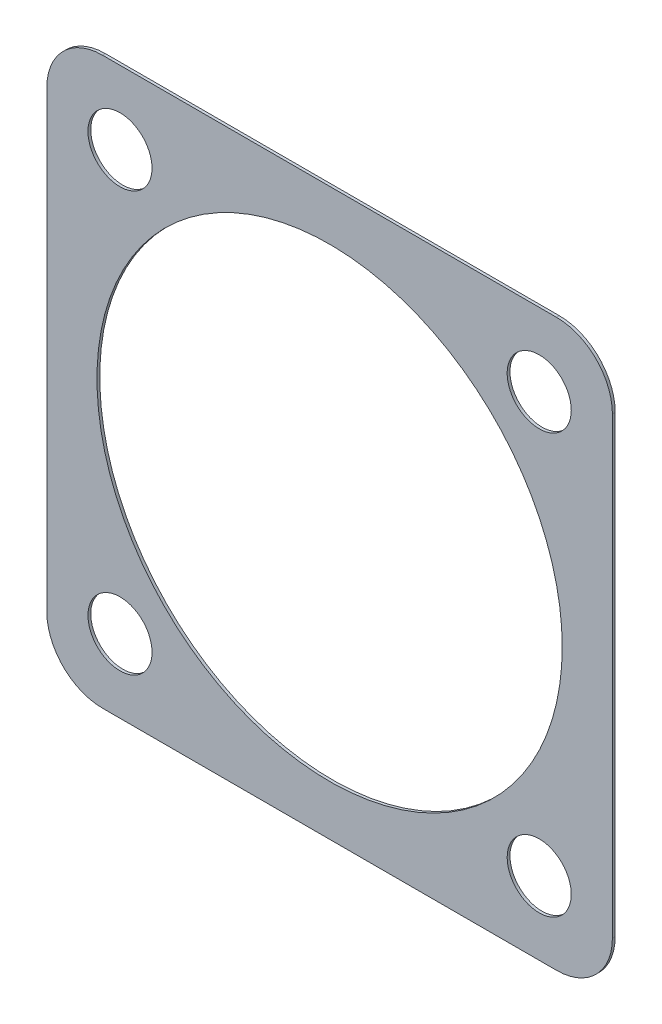
ISO-10303-21;
HEADER;
FILE_DESCRIPTION(('STEP AP214'),'2;1');
FILE_NAME('part.step','',(''),(''),'','','');
FILE_SCHEMA(('AUTOMOTIVE_DESIGN { 1 0 10303 214 1 1 1 1 }'));
ENDSEC;
DATA;
#1=APPLICATION_CONTEXT('core data for automotive mechanical design processes');
#2=APPLICATION_PROTOCOL_DEFINITION('international standard','automotive_design',2000,#1);
#3=PRODUCT_CONTEXT('',#1,'mechanical');
#4=PRODUCT('Part','Part','',(#3));
#5=PRODUCT_RELATED_PRODUCT_CATEGORY('part','',(#4));
#6=PRODUCT_DEFINITION_FORMATION('','',#4);
#7=PRODUCT_DEFINITION_CONTEXT('part definition',#1,'design');
#8=PRODUCT_DEFINITION('design','',#6,#7);
#9=PRODUCT_DEFINITION_SHAPE('','',#8);
#10=(LENGTH_UNIT() NAMED_UNIT(*) SI_UNIT(.MILLI.,.METRE.));
#11=(NAMED_UNIT(*) PLANE_ANGLE_UNIT() SI_UNIT($,.RADIAN.));
#12=(NAMED_UNIT(*) SI_UNIT($,.STERADIAN.) SOLID_ANGLE_UNIT());
#13=UNCERTAINTY_MEASURE_WITH_UNIT(LENGTH_MEASURE(1.E-05),#10,'distance_accuracy_value','');
#14=(GEOMETRIC_REPRESENTATION_CONTEXT(3) GLOBAL_UNCERTAINTY_ASSIGNED_CONTEXT((#13)) GLOBAL_UNIT_ASSIGNED_CONTEXT((#10,
#11,#12)) REPRESENTATION_CONTEXT('',''));
#15=CARTESIAN_POINT('',(0.,0.,0.));
#16=DIRECTION('',(0.,0.,1.));
#17=DIRECTION('',(1.,0.,0.));
#18=AXIS2_PLACEMENT_3D('',#15,#16,#17);
#19=CARTESIAN_POINT('',(40.75,40.75,0.5));
#20=DIRECTION('',(0.,0.,1.));
#21=DIRECTION('',(1.,0.,0.));
#22=AXIS2_PLACEMENT_3D('',#19,#20,#21);
#23=PLANE('',#22);
#24=CARTESIAN_POINT('',(37.6180807591243,-37.6180807591243,0.5));
#25=DIRECTION('',(0.,0.,1.));
#26=DIRECTION('',(-1.,0.,0.));
#27=AXIS2_PLACEMENT_3D('',#24,#25,#26);
#28=CIRCLE('',#27,5.74999999999999);
#29=CARTESIAN_POINT('',(31.8680807591243,-37.6180807591243,0.5));
#30=VERTEX_POINT('',#29);
#31=EDGE_CURVE('E202',#30,#30,#28,.T.);
#32=ORIENTED_EDGE('',*,*,#31,.F.);
#33=EDGE_LOOP('',(#32));
#34=FACE_BOUND('',#33,.T.);
#35=CARTESIAN_POINT('',(-37.6180807591243,37.6180807591243,0.5));
#36=DIRECTION('',(0.,0.,1.));
#37=DIRECTION('',(-1.,0.,0.));
#38=AXIS2_PLACEMENT_3D('',#35,#36,#37);
#39=CIRCLE('',#38,5.74999999999999);
#40=CARTESIAN_POINT('',(-43.3680807591243,37.6180807591243,0.5));
#41=VERTEX_POINT('',#40);
#42=EDGE_CURVE('E190',#41,#41,#39,.T.);
#43=ORIENTED_EDGE('',*,*,#42,.F.);
#44=EDGE_LOOP('',(#43));
#45=FACE_BOUND('',#44,.T.);
#46=CARTESIAN_POINT('',(40.75,40.75,0.5));
#47=DIRECTION('',(0.,0.,1.));
#48=DIRECTION('',(1.,0.,0.));
#49=AXIS2_PLACEMENT_3D('',#46,#47,#48);
#50=CIRCLE('',#49,10.);
#51=CARTESIAN_POINT('',(50.75,40.75,0.5));
#52=VERTEX_POINT('',#51);
#53=CARTESIAN_POINT('',(40.75,50.75,0.5));
#54=VERTEX_POINT('',#53);
#55=EDGE_CURVE('E153',#52,#54,#50,.T.);
#56=ORIENTED_EDGE('',*,*,#55,.T.);
#57=DIRECTION('',(-1.,0.,0.));
#58=VECTOR('',#57,1.);
#59=CARTESIAN_POINT('',(-40.75,50.75,0.5));
#60=LINE('',#59,#58);
#61=CARTESIAN_POINT('',(-40.75,50.75,0.5));
#62=VERTEX_POINT('',#61);
#63=EDGE_CURVE('E101',#54,#62,#60,.T.);
#64=ORIENTED_EDGE('',*,*,#63,.T.);
#65=CARTESIAN_POINT('',(-40.75,40.75,0.5));
#66=DIRECTION('',(0.,0.,1.));
#67=DIRECTION('',(-1.,0.,0.));
#68=AXIS2_PLACEMENT_3D('',#65,#66,#67);
#69=CIRCLE('',#68,10.);
#70=CARTESIAN_POINT('',(-50.75,40.75,0.5));
#71=VERTEX_POINT('',#70);
#72=EDGE_CURVE('E168',#62,#71,#69,.T.);
#73=ORIENTED_EDGE('',*,*,#72,.T.);
#74=DIRECTION('',(0.,-1.,0.));
#75=VECTOR('',#74,1.);
#76=CARTESIAN_POINT('',(-50.75,40.75,0.5));
#77=LINE('',#76,#75);
#78=CARTESIAN_POINT('',(-50.75,-40.75,0.5));
#79=VERTEX_POINT('',#78);
#80=EDGE_CURVE('E181',#71,#79,#77,.T.);
#81=ORIENTED_EDGE('',*,*,#80,.T.);
#82=CARTESIAN_POINT('',(-40.75,-40.75,0.5));
#83=DIRECTION('',(0.,0.,1.));
#84=DIRECTION('',(1.,0.,0.));
#85=AXIS2_PLACEMENT_3D('',#82,#83,#84);
#86=CIRCLE('',#85,10.);
#87=CARTESIAN_POINT('',(-40.75,-50.75,0.5));
#88=VERTEX_POINT('',#87);
#89=EDGE_CURVE('E120',#79,#88,#86,.T.);
#90=ORIENTED_EDGE('',*,*,#89,.T.);
#91=DIRECTION('',(1.,0.,0.));
#92=VECTOR('',#91,1.);
#93=CARTESIAN_POINT('',(-40.75,-50.75,0.5));
#94=LINE('',#93,#92);
#95=CARTESIAN_POINT('',(40.75,-50.75,0.5));
#96=VERTEX_POINT('',#95);
#97=EDGE_CURVE('E114',#88,#96,#94,.T.);
#98=ORIENTED_EDGE('',*,*,#97,.T.);
#99=CARTESIAN_POINT('',(40.75,-40.75,0.5));
#100=DIRECTION('',(0.,0.,1.));
#101=DIRECTION('',(-1.,0.,0.));
#102=AXIS2_PLACEMENT_3D('',#99,#100,#101);
#103=CIRCLE('',#102,10.);
#104=CARTESIAN_POINT('',(50.75,-40.75,0.5));
#105=VERTEX_POINT('',#104);
#106=EDGE_CURVE('E118',#96,#105,#103,.T.);
#107=ORIENTED_EDGE('',*,*,#106,.T.);
#108=DIRECTION('',(0.,1.,0.));
#109=VECTOR('',#108,1.);
#110=CARTESIAN_POINT('',(50.75,40.75,0.5));
#111=LINE('',#110,#109);
#112=EDGE_CURVE('E58',#105,#52,#111,.T.);
#113=ORIENTED_EDGE('',*,*,#112,.T.);
#114=EDGE_LOOP('',(#56,#64,#73,#81,#90,#98,#107,#113));
#115=FACE_BOUND('',#114,.T.);
#116=CARTESIAN_POINT('',(37.6180807591243,37.6180807591243,0.5));
#117=DIRECTION('',(0.,0.,1.));
#118=DIRECTION('',(1.,0.,0.));
#119=AXIS2_PLACEMENT_3D('',#116,#117,#118);
#120=CIRCLE('',#119,5.74999999999999);
#121=CARTESIAN_POINT('',(43.3680807591243,37.6180807591243,0.5));
#122=VERTEX_POINT('',#121);
#123=EDGE_CURVE('E142',#122,#122,#120,.T.);
#124=ORIENTED_EDGE('',*,*,#123,.F.);
#125=EDGE_LOOP('',(#124));
#126=FACE_BOUND('',#125,.T.);
#127=CARTESIAN_POINT('',(-37.6180807591243,-37.6180807591243,0.5));
#128=DIRECTION('',(0.,0.,1.));
#129=DIRECTION('',(1.,0.,0.));
#130=AXIS2_PLACEMENT_3D('',#127,#128,#129);
#131=CIRCLE('',#130,5.74999999999999);
#132=CARTESIAN_POINT('',(-31.8680807591243,-37.6180807591243,0.5));
#133=VERTEX_POINT('',#132);
#134=EDGE_CURVE('E196',#133,#133,#131,.T.);
#135=ORIENTED_EDGE('',*,*,#134,.F.);
#136=EDGE_LOOP('',(#135));
#137=FACE_BOUND('',#136,.T.);
#138=CARTESIAN_POINT('',(0.,0.,0.5));
#139=DIRECTION('',(0.,0.,1.));
#140=DIRECTION('',(1.,0.,0.));
#141=AXIS2_PLACEMENT_3D('',#138,#139,#140);
#142=CIRCLE('',#141,41.75);
#143=CARTESIAN_POINT('',(41.75,0.,0.5));
#144=VERTEX_POINT('',#143);
#145=EDGE_CURVE('E208',#144,#144,#142,.T.);
#146=ORIENTED_EDGE('',*,*,#145,.F.);
#147=EDGE_LOOP('',(#146));
#148=FACE_BOUND('',#147,.T.);
#149=ADVANCED_FACE('F41',(#34,#45,#115,#126,#137,#148),#23,.T.);
#150=CARTESIAN_POINT('',(40.75,40.75,0.));
#151=DIRECTION('',(0.,0.,1.));
#152=DIRECTION('',(1.,0.,0.));
#153=AXIS2_PLACEMENT_3D('',#150,#151,#152);
#154=PLANE('',#153);
#155=CARTESIAN_POINT('',(40.75,40.75,0.));
#156=DIRECTION('',(0.,0.,1.));
#157=DIRECTION('',(1.,0.,0.));
#158=AXIS2_PLACEMENT_3D('',#155,#156,#157);
#159=CIRCLE('',#158,10.);
#160=CARTESIAN_POINT('',(50.75,40.75,0.));
#161=VERTEX_POINT('',#160);
#162=CARTESIAN_POINT('',(40.75,50.75,0.));
#163=VERTEX_POINT('',#162);
#164=EDGE_CURVE('E138',#161,#163,#159,.T.);
#165=ORIENTED_EDGE('',*,*,#164,.F.);
#166=DIRECTION('',(0.,1.,0.));
#167=VECTOR('',#166,1.);
#168=CARTESIAN_POINT('',(50.75,40.75,0.));
#169=LINE('',#168,#167);
#170=CARTESIAN_POINT('',(50.75,-40.75,0.));
#171=VERTEX_POINT('',#170);
#172=EDGE_CURVE('E93',#171,#161,#169,.T.);
#173=ORIENTED_EDGE('',*,*,#172,.F.);
#174=CARTESIAN_POINT('',(40.75,-40.75,0.));
#175=DIRECTION('',(0.,0.,1.));
#176=DIRECTION('',(-1.,0.,0.));
#177=AXIS2_PLACEMENT_3D('',#174,#175,#176);
#178=CIRCLE('',#177,10.);
#179=CARTESIAN_POINT('',(40.75,-50.75,0.));
#180=VERTEX_POINT('',#179);
#181=EDGE_CURVE('E87',#180,#171,#178,.T.);
#182=ORIENTED_EDGE('',*,*,#181,.F.);
#183=DIRECTION('',(1.,0.,0.));
#184=VECTOR('',#183,1.);
#185=CARTESIAN_POINT('',(-40.75,-50.75,0.));
#186=LINE('',#185,#184);
#187=CARTESIAN_POINT('',(-40.75,-50.75,0.));
#188=VERTEX_POINT('',#187);
#189=EDGE_CURVE('E128',#188,#180,#186,.T.);
#190=ORIENTED_EDGE('',*,*,#189,.F.);
#191=CARTESIAN_POINT('',(-40.75,-40.75,0.));
#192=DIRECTION('',(0.,0.,1.));
#193=DIRECTION('',(1.,0.,0.));
#194=AXIS2_PLACEMENT_3D('',#191,#192,#193);
#195=CIRCLE('',#194,10.);
#196=CARTESIAN_POINT('',(-50.75,-40.75,0.));
#197=VERTEX_POINT('',#196);
#198=EDGE_CURVE('E148',#197,#188,#195,.T.);
#199=ORIENTED_EDGE('',*,*,#198,.F.);
#200=DIRECTION('',(0.,-1.,0.));
#201=VECTOR('',#200,1.);
#202=CARTESIAN_POINT('',(-50.75,40.75,0.));
#203=LINE('',#202,#201);
#204=CARTESIAN_POINT('',(-50.75,40.75,0.));
#205=VERTEX_POINT('',#204);
#206=EDGE_CURVE('E146',#205,#197,#203,.T.);
#207=ORIENTED_EDGE('',*,*,#206,.F.);
#208=CARTESIAN_POINT('',(-40.75,40.75,0.));
#209=DIRECTION('',(0.,0.,1.));
#210=DIRECTION('',(-1.,0.,0.));
#211=AXIS2_PLACEMENT_3D('',#208,#209,#210);
#212=CIRCLE('',#211,10.);
#213=CARTESIAN_POINT('',(-40.75,50.75,0.));
#214=VERTEX_POINT('',#213);
#215=EDGE_CURVE('E144',#214,#205,#212,.T.);
#216=ORIENTED_EDGE('',*,*,#215,.F.);
#217=DIRECTION('',(-1.,0.,0.));
#218=VECTOR('',#217,1.);
#219=CARTESIAN_POINT('',(-40.75,50.75,0.));
#220=LINE('',#219,#218);
#221=EDGE_CURVE('E141',#163,#214,#220,.T.);
#222=ORIENTED_EDGE('',*,*,#221,.F.);
#223=EDGE_LOOP('',(#165,#173,#182,#190,#199,#207,#216,#222));
#224=FACE_BOUND('',#223,.T.);
#225=CARTESIAN_POINT('',(37.6180807591243,37.6180807591243,0.));
#226=DIRECTION('',(0.,0.,1.));
#227=DIRECTION('',(1.,0.,0.));
#228=AXIS2_PLACEMENT_3D('',#225,#226,#227);
#229=CIRCLE('',#228,5.74999999999999);
#230=CARTESIAN_POINT('',(43.3680807591243,37.6180807591243,0.));
#231=VERTEX_POINT('',#230);
#232=EDGE_CURVE('E187',#231,#231,#229,.T.);
#233=ORIENTED_EDGE('',*,*,#232,.T.);
#234=EDGE_LOOP('',(#233));
#235=FACE_BOUND('',#234,.T.);
#236=CARTESIAN_POINT('',(-37.6180807591243,37.6180807591243,0.));
#237=DIRECTION('',(0.,0.,1.));
#238=DIRECTION('',(-1.,0.,0.));
#239=AXIS2_PLACEMENT_3D('',#236,#237,#238);
#240=CIRCLE('',#239,5.74999999999999);
#241=CARTESIAN_POINT('',(-43.3680807591243,37.6180807591243,0.));
#242=VERTEX_POINT('',#241);
#243=EDGE_CURVE('E193',#242,#242,#240,.T.);
#244=ORIENTED_EDGE('',*,*,#243,.T.);
#245=EDGE_LOOP('',(#244));
#246=FACE_BOUND('',#245,.T.);
#247=CARTESIAN_POINT('',(-37.6180807591243,-37.6180807591243,0.));
#248=DIRECTION('',(0.,0.,1.));
#249=DIRECTION('',(1.,0.,0.));
#250=AXIS2_PLACEMENT_3D('',#247,#248,#249);
#251=CIRCLE('',#250,5.74999999999999);
#252=CARTESIAN_POINT('',(-31.8680807591243,-37.6180807591243,0.));
#253=VERTEX_POINT('',#252);
#254=EDGE_CURVE('E199',#253,#253,#251,.T.);
#255=ORIENTED_EDGE('',*,*,#254,.T.);
#256=EDGE_LOOP('',(#255));
#257=FACE_BOUND('',#256,.T.);
#258=CARTESIAN_POINT('',(37.6180807591243,-37.6180807591243,0.));
#259=DIRECTION('',(0.,0.,1.));
#260=DIRECTION('',(-1.,0.,0.));
#261=AXIS2_PLACEMENT_3D('',#258,#259,#260);
#262=CIRCLE('',#261,5.74999999999999);
#263=CARTESIAN_POINT('',(31.8680807591243,-37.6180807591243,0.));
#264=VERTEX_POINT('',#263);
#265=EDGE_CURVE('E205',#264,#264,#262,.T.);
#266=ORIENTED_EDGE('',*,*,#265,.T.);
#267=EDGE_LOOP('',(#266));
#268=FACE_BOUND('',#267,.T.);
#269=CARTESIAN_POINT('',(0.,0.,0.));
#270=DIRECTION('',(0.,0.,1.));
#271=DIRECTION('',(1.,0.,0.));
#272=AXIS2_PLACEMENT_3D('',#269,#270,#271);
#273=CIRCLE('',#272,41.75);
#274=CARTESIAN_POINT('',(41.75,0.,0.));
#275=VERTEX_POINT('',#274);
#276=EDGE_CURVE('E211',#275,#275,#273,.T.);
#277=ORIENTED_EDGE('',*,*,#276,.T.);
#278=EDGE_LOOP('',(#277));
#279=FACE_BOUND('',#278,.T.);
#280=ADVANCED_FACE('F172',(#224,#235,#246,#257,#268,#279),#154,.F.);
#281=CARTESIAN_POINT('',(40.75,40.75,0.5));
#282=DIRECTION('',(0.,0.,-1.));
#283=DIRECTION('',(-1.,0.,0.));
#284=AXIS2_PLACEMENT_3D('',#281,#282,#283);
#285=CYLINDRICAL_SURFACE('',#284,10.);
#286=ORIENTED_EDGE('',*,*,#164,.T.);
#287=DIRECTION('',(0.,0.,-1.));
#288=VECTOR('',#287,1.);
#289=CARTESIAN_POINT('',(40.75,50.75,0.5));
#290=LINE('',#289,#288);
#291=EDGE_CURVE('E11',#54,#163,#290,.T.);
#292=ORIENTED_EDGE('',*,*,#291,.F.);
#293=ORIENTED_EDGE('',*,*,#55,.F.);
#294=DIRECTION('',(0.,0.,-1.));
#295=VECTOR('',#294,1.);
#296=CARTESIAN_POINT('',(50.75,40.75,0.5));
#297=LINE('',#296,#295);
#298=EDGE_CURVE('E134',#52,#161,#297,.T.);
#299=ORIENTED_EDGE('',*,*,#298,.T.);
#300=EDGE_LOOP('',(#286,#292,#293,#299));
#301=FACE_BOUND('',#300,.T.);
#302=ADVANCED_FACE('F43',(#301),#285,.T.);
#303=CARTESIAN_POINT('',(-40.75,50.75,0.5));
#304=DIRECTION('',(0.,-1.,0.));
#305=DIRECTION('',(0.,0.,-1.));
#306=AXIS2_PLACEMENT_3D('',#303,#304,#305);
#307=PLANE('',#306);
#308=ORIENTED_EDGE('',*,*,#221,.T.);
#309=DIRECTION('',(0.,0.,-1.));
#310=VECTOR('',#309,1.);
#311=CARTESIAN_POINT('',(-40.75,50.75,0.5));
#312=LINE('',#311,#310);
#313=EDGE_CURVE('E50',#62,#214,#312,.T.);
#314=ORIENTED_EDGE('',*,*,#313,.F.);
#315=ORIENTED_EDGE('',*,*,#63,.F.);
#316=ORIENTED_EDGE('',*,*,#291,.T.);
#317=EDGE_LOOP('',(#308,#314,#315,#316));
#318=FACE_BOUND('',#317,.T.);
#319=ADVANCED_FACE('F245',(#318),#307,.F.);
#320=CARTESIAN_POINT('',(-40.75,40.75,0.5));
#321=DIRECTION('',(0.,0.,-1.));
#322=DIRECTION('',(-1.,0.,0.));
#323=AXIS2_PLACEMENT_3D('',#320,#321,#322);
#324=CYLINDRICAL_SURFACE('',#323,10.);
#325=ORIENTED_EDGE('',*,*,#215,.T.);
#326=DIRECTION('',(0.,0.,-1.));
#327=VECTOR('',#326,1.);
#328=CARTESIAN_POINT('',(-50.75,40.75,0.5));
#329=LINE('',#328,#327);
#330=EDGE_CURVE('E160',#71,#205,#329,.T.);
#331=ORIENTED_EDGE('',*,*,#330,.F.);
#332=ORIENTED_EDGE('',*,*,#72,.F.);
#333=ORIENTED_EDGE('',*,*,#313,.T.);
#334=EDGE_LOOP('',(#325,#331,#332,#333));
#335=FACE_BOUND('',#334,.T.);
#336=ADVANCED_FACE('F166',(#335),#324,.T.);
#337=CARTESIAN_POINT('',(-50.75,40.75,0.5));
#338=DIRECTION('',(1.,0.,0.));
#339=DIRECTION('',(0.,0.,-1.));
#340=AXIS2_PLACEMENT_3D('',#337,#338,#339);
#341=PLANE('',#340);
#342=ORIENTED_EDGE('',*,*,#206,.T.);
#343=DIRECTION('',(0.,0.,-1.));
#344=VECTOR('',#343,1.);
#345=CARTESIAN_POINT('',(-50.75,-40.75,0.5));
#346=LINE('',#345,#344);
#347=EDGE_CURVE('E157',#79,#197,#346,.T.);
#348=ORIENTED_EDGE('',*,*,#347,.F.);
#349=ORIENTED_EDGE('',*,*,#80,.F.);
#350=ORIENTED_EDGE('',*,*,#330,.T.);
#351=EDGE_LOOP('',(#342,#348,#349,#350));
#352=FACE_BOUND('',#351,.T.);
#353=ADVANCED_FACE('F177',(#352),#341,.F.);
#354=CARTESIAN_POINT('',(-40.75,-40.75,0.5));
#355=DIRECTION('',(0.,0.,-1.));
#356=DIRECTION('',(-1.,0.,0.));
#357=AXIS2_PLACEMENT_3D('',#354,#355,#356);
#358=CYLINDRICAL_SURFACE('',#357,10.);
#359=ORIENTED_EDGE('',*,*,#198,.T.);
#360=DIRECTION('',(0.,0.,-1.));
#361=VECTOR('',#360,1.);
#362=CARTESIAN_POINT('',(-40.75,-50.75,0.5));
#363=LINE('',#362,#361);
#364=EDGE_CURVE('E129',#88,#188,#363,.T.);
#365=ORIENTED_EDGE('',*,*,#364,.F.);
#366=ORIENTED_EDGE('',*,*,#89,.F.);
#367=ORIENTED_EDGE('',*,*,#347,.T.);
#368=EDGE_LOOP('',(#359,#365,#366,#367));
#369=FACE_BOUND('',#368,.T.);
#370=ADVANCED_FACE('F180',(#369),#358,.T.);
#371=CARTESIAN_POINT('',(-40.75,-50.75,0.5));
#372=DIRECTION('',(0.,1.,0.));
#373=DIRECTION('',(0.,0.,1.));
#374=AXIS2_PLACEMENT_3D('',#371,#372,#373);
#375=PLANE('',#374);
#376=ORIENTED_EDGE('',*,*,#189,.T.);
#377=DIRECTION('',(0.,0.,-1.));
#378=VECTOR('',#377,1.);
#379=CARTESIAN_POINT('',(40.75,-50.75,0.5));
#380=LINE('',#379,#378);
#381=EDGE_CURVE('E125',#96,#180,#380,.T.);
#382=ORIENTED_EDGE('',*,*,#381,.F.);
#383=ORIENTED_EDGE('',*,*,#97,.F.);
#384=ORIENTED_EDGE('',*,*,#364,.T.);
#385=EDGE_LOOP('',(#376,#382,#383,#384));
#386=FACE_BOUND('',#385,.T.);
#387=ADVANCED_FACE('F126',(#386),#375,.F.);
#388=CARTESIAN_POINT('',(40.75,-40.75,0.5));
#389=DIRECTION('',(0.,0.,-1.));
#390=DIRECTION('',(-1.,0.,0.));
#391=AXIS2_PLACEMENT_3D('',#388,#389,#390);
#392=CYLINDRICAL_SURFACE('',#391,10.);
#393=ORIENTED_EDGE('',*,*,#181,.T.);
#394=DIRECTION('',(0.,0.,-1.));
#395=VECTOR('',#394,1.);
#396=CARTESIAN_POINT('',(50.75,-40.75,0.5));
#397=LINE('',#396,#395);
#398=EDGE_CURVE('E130',#105,#171,#397,.T.);
#399=ORIENTED_EDGE('',*,*,#398,.F.);
#400=ORIENTED_EDGE('',*,*,#106,.F.);
#401=ORIENTED_EDGE('',*,*,#381,.T.);
#402=EDGE_LOOP('',(#393,#399,#400,#401));
#403=FACE_BOUND('',#402,.T.);
#404=ADVANCED_FACE('F132',(#403),#392,.T.);
#405=CARTESIAN_POINT('',(50.75,40.75,0.5));
#406=DIRECTION('',(-1.,0.,0.));
#407=DIRECTION('',(0.,0.,1.));
#408=AXIS2_PLACEMENT_3D('',#405,#406,#407);
#409=PLANE('',#408);
#410=ORIENTED_EDGE('',*,*,#172,.T.);
#411=ORIENTED_EDGE('',*,*,#298,.F.);
#412=ORIENTED_EDGE('',*,*,#112,.F.);
#413=ORIENTED_EDGE('',*,*,#398,.T.);
#414=EDGE_LOOP('',(#410,#411,#412,#413));
#415=FACE_BOUND('',#414,.T.);
#416=ADVANCED_FACE('F233',(#415),#409,.F.);
#417=CARTESIAN_POINT('',(37.6180807591243,37.6180807591243,0.5));
#418=DIRECTION('',(0.,0.,-1.));
#419=DIRECTION('',(-1.,0.,0.));
#420=AXIS2_PLACEMENT_3D('',#417,#418,#419);
#421=CYLINDRICAL_SURFACE('',#420,5.74999999999999);
#422=ORIENTED_EDGE('',*,*,#123,.T.);
#423=EDGE_LOOP('',(#422));
#424=FACE_BOUND('',#423,.T.);
#425=ORIENTED_EDGE('',*,*,#232,.F.);
#426=EDGE_LOOP('',(#425));
#427=FACE_BOUND('',#426,.T.);
#428=ADVANCED_FACE('F230',(#424,#427),#421,.F.);
#429=CARTESIAN_POINT('',(-37.6180807591243,37.6180807591243,0.5));
#430=DIRECTION('',(0.,0.,-1.));
#431=DIRECTION('',(-1.,0.,0.));
#432=AXIS2_PLACEMENT_3D('',#429,#430,#431);
#433=CYLINDRICAL_SURFACE('',#432,5.74999999999999);
#434=ORIENTED_EDGE('',*,*,#42,.T.);
#435=EDGE_LOOP('',(#434));
#436=FACE_BOUND('',#435,.T.);
#437=ORIENTED_EDGE('',*,*,#243,.F.);
#438=EDGE_LOOP('',(#437));
#439=FACE_BOUND('',#438,.T.);
#440=ADVANCED_FACE('F308',(#436,#439),#433,.F.);
#441=CARTESIAN_POINT('',(-37.6180807591243,-37.6180807591243,0.5));
#442=DIRECTION('',(0.,0.,-1.));
#443=DIRECTION('',(-1.,0.,0.));
#444=AXIS2_PLACEMENT_3D('',#441,#442,#443);
#445=CYLINDRICAL_SURFACE('',#444,5.74999999999999);
#446=ORIENTED_EDGE('',*,*,#134,.T.);
#447=EDGE_LOOP('',(#446));
#448=FACE_BOUND('',#447,.T.);
#449=ORIENTED_EDGE('',*,*,#254,.F.);
#450=EDGE_LOOP('',(#449));
#451=FACE_BOUND('',#450,.T.);
#452=ADVANCED_FACE('F316',(#448,#451),#445,.F.);
#453=CARTESIAN_POINT('',(37.6180807591243,-37.6180807591243,0.5));
#454=DIRECTION('',(0.,0.,-1.));
#455=DIRECTION('',(-1.,0.,0.));
#456=AXIS2_PLACEMENT_3D('',#453,#454,#455);
#457=CYLINDRICAL_SURFACE('',#456,5.74999999999999);
#458=ORIENTED_EDGE('',*,*,#31,.T.);
#459=EDGE_LOOP('',(#458));
#460=FACE_BOUND('',#459,.T.);
#461=ORIENTED_EDGE('',*,*,#265,.F.);
#462=EDGE_LOOP('',(#461));
#463=FACE_BOUND('',#462,.T.);
#464=ADVANCED_FACE('F324',(#460,#463),#457,.F.);
#465=CARTESIAN_POINT('',(0.,0.,0.5));
#466=DIRECTION('',(0.,0.,-1.));
#467=DIRECTION('',(-1.,0.,0.));
#468=AXIS2_PLACEMENT_3D('',#465,#466,#467);
#469=CYLINDRICAL_SURFACE('',#468,41.75);
#470=ORIENTED_EDGE('',*,*,#145,.T.);
#471=EDGE_LOOP('',(#470));
#472=FACE_BOUND('',#471,.T.);
#473=ORIENTED_EDGE('',*,*,#276,.F.);
#474=EDGE_LOOP('',(#473));
#475=FACE_BOUND('',#474,.T.);
#476=ADVANCED_FACE('F217',(#472,#475),#469,.F.);
#477=CLOSED_SHELL('',(#149,#280,#302,#319,#336,#353,#370,#387,#404,#416,#428,#440,#452,#464,#476));
#478=MANIFOLD_SOLID_BREP('B2',#477);
#479=ADVANCED_BREP_SHAPE_REPRESENTATION('',(#18,#478),#14);
#480=SHAPE_DEFINITION_REPRESENTATION(#9,#479);
ENDSEC;
END-ISO-10303-21;
